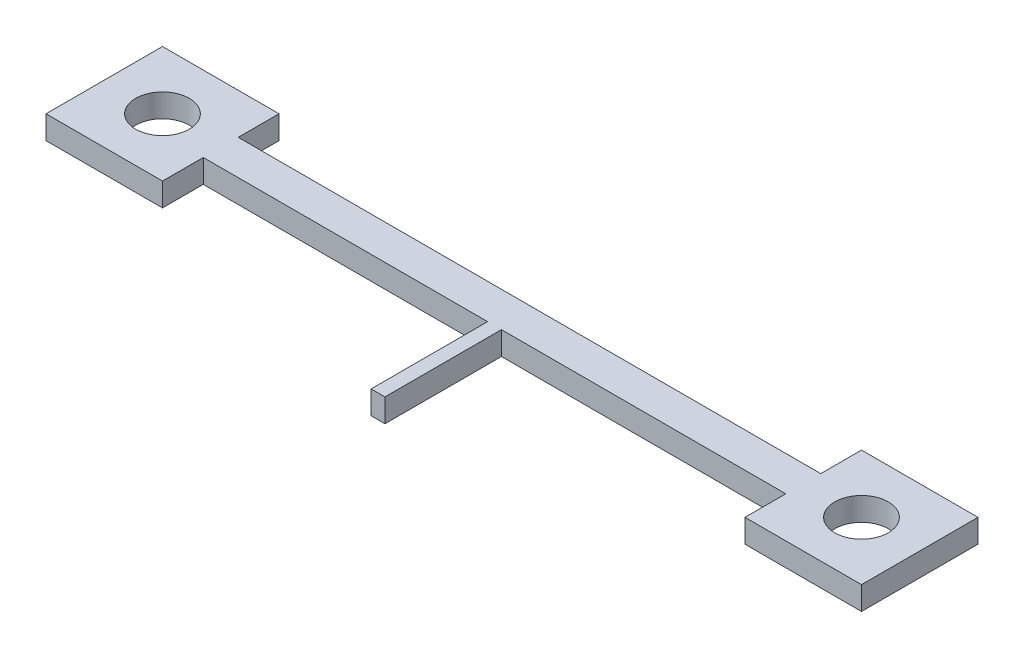
ISO-10303-21;
HEADER;
FILE_DESCRIPTION(('STEP AP214'),'2;1');
FILE_NAME('part.step','',(''),(''),'','','');
FILE_SCHEMA(('AUTOMOTIVE_DESIGN { 1 0 10303 214 1 1 1 1 }'));
ENDSEC;
DATA;
#1=APPLICATION_CONTEXT('core data for automotive mechanical design processes');
#2=APPLICATION_PROTOCOL_DEFINITION('international standard','automotive_design',2000,#1);
#3=PRODUCT_CONTEXT('',#1,'mechanical');
#4=PRODUCT('Part','Part','',(#3));
#5=PRODUCT_RELATED_PRODUCT_CATEGORY('part','',(#4));
#6=PRODUCT_DEFINITION_FORMATION('','',#4);
#7=PRODUCT_DEFINITION_CONTEXT('part definition',#1,'design');
#8=PRODUCT_DEFINITION('design','',#6,#7);
#9=PRODUCT_DEFINITION_SHAPE('','',#8);
#10=(LENGTH_UNIT() NAMED_UNIT(*) SI_UNIT(.MILLI.,.METRE.));
#11=(NAMED_UNIT(*) PLANE_ANGLE_UNIT() SI_UNIT($,.RADIAN.));
#12=(NAMED_UNIT(*) SI_UNIT($,.STERADIAN.) SOLID_ANGLE_UNIT());
#13=UNCERTAINTY_MEASURE_WITH_UNIT(LENGTH_MEASURE(1.E-05),#10,'distance_accuracy_value','');
#14=(GEOMETRIC_REPRESENTATION_CONTEXT(3) GLOBAL_UNCERTAINTY_ASSIGNED_CONTEXT((#13)) GLOBAL_UNIT_ASSIGNED_CONTEXT((#10,
#11,#12)) REPRESENTATION_CONTEXT('',''));
#15=CARTESIAN_POINT('',(0.,0.,0.));
#16=DIRECTION('',(0.,0.,1.));
#17=DIRECTION('',(1.,0.,0.));
#18=AXIS2_PLACEMENT_3D('',#15,#16,#17);
#19=CARTESIAN_POINT('',(-41.4240464845624,0.635,10.2832594653076));
#20=DIRECTION('',(0.,0.,-1.));
#21=DIRECTION('',(-1.,0.,0.));
#22=AXIS2_PLACEMENT_3D('',#19,#20,#21);
#23=PLANE('',#22);
#24=DIRECTION('',(0.,1.,0.));
#25=VECTOR('',#24,1.);
#26=CARTESIAN_POINT('',(-25.1720464765624,0.635,10.2832594653076));
#27=LINE('',#26,#25);
#28=CARTESIAN_POINT('',(-25.1720464765624,-0.634999999999999,10.2832594653076));
#29=VERTEX_POINT('',#28);
#30=CARTESIAN_POINT('',(-25.1720464765624,0.635,10.2832594653076));
#31=VERTEX_POINT('',#30);
#32=EDGE_CURVE('E499',#29,#31,#27,.T.);
#33=ORIENTED_EDGE('',*,*,#32,.F.);
#34=DIRECTION('',(1.,0.,0.));
#35=VECTOR('',#34,1.);
#36=CARTESIAN_POINT('',(-41.4240464845624,-0.635,10.2832594653076));
#37=LINE('',#36,#35);
#38=CARTESIAN_POINT('',(-9.67404648456241,-0.635,10.2832594653076));
#39=VERTEX_POINT('',#38);
#40=EDGE_CURVE('E181',#29,#39,#37,.T.);
#41=ORIENTED_EDGE('',*,*,#40,.T.);
#42=DIRECTION('',(0.,-1.,0.));
#43=VECTOR('',#42,1.);
#44=CARTESIAN_POINT('',(-9.67404648456241,0.635,10.2832594653076));
#45=LINE('',#44,#43);
#46=CARTESIAN_POINT('',(-9.67404648456241,0.635,10.2832594653076));
#47=VERTEX_POINT('',#46);
#48=EDGE_CURVE('E154',#47,#39,#45,.T.);
#49=ORIENTED_EDGE('',*,*,#48,.F.);
#50=DIRECTION('',(1.,0.,0.));
#51=VECTOR('',#50,1.);
#52=CARTESIAN_POINT('',(-41.4240464845624,0.635,10.2832594653076));
#53=LINE('',#52,#51);
#54=EDGE_CURVE('E144',#31,#47,#53,.T.);
#55=ORIENTED_EDGE('',*,*,#54,.F.);
#56=EDGE_LOOP('',(#33,#41,#49,#55));
#57=FACE_BOUND('',#56,.T.);
#58=ADVANCED_FACE('F36',(#57),#23,.F.);
#59=CARTESIAN_POINT('',(-41.4240464845624,-0.635,10.2832594653076));
#60=VERTEX_POINT('',#59);
#61=CARTESIAN_POINT('',(-25.9260464925624,-0.635,10.2832594653076));
#62=VERTEX_POINT('',#61);
#63=EDGE_CURVE('E182',#60,#62,#37,.T.);
#64=ORIENTED_EDGE('',*,*,#63,.T.);
#65=DIRECTION('',(0.,-1.,0.));
#66=VECTOR('',#65,1.);
#67=CARTESIAN_POINT('',(-25.9260464925624,0.635,10.2832594653076));
#68=LINE('',#67,#66);
#69=CARTESIAN_POINT('',(-25.9260464925624,0.635,10.2832594653076));
#70=VERTEX_POINT('',#69);
#71=EDGE_CURVE('E258',#70,#62,#68,.T.);
#72=ORIENTED_EDGE('',*,*,#71,.F.);
#73=CARTESIAN_POINT('',(-41.4240464845624,0.635,10.2832594653076));
#74=VERTEX_POINT('',#73);
#75=EDGE_CURVE('E148',#74,#70,#53,.T.);
#76=ORIENTED_EDGE('',*,*,#75,.F.);
#77=DIRECTION('',(0.,-1.,0.));
#78=VECTOR('',#77,1.);
#79=CARTESIAN_POINT('',(-41.4240464845624,0.635,10.2832594653076));
#80=LINE('',#79,#78);
#81=EDGE_CURVE('E192',#74,#60,#80,.T.);
#82=ORIENTED_EDGE('',*,*,#81,.T.);
#83=EDGE_LOOP('',(#64,#72,#76,#82));
#84=FACE_BOUND('',#83,.T.);
#85=ADVANCED_FACE('F255',(#84),#23,.F.);
#86=CARTESIAN_POINT('',(-9.67404648456241,0.635,6.15575946530759));
#87=DIRECTION('',(0.,0.,1.));
#88=DIRECTION('',(1.,0.,0.));
#89=AXIS2_PLACEMENT_3D('',#86,#87,#88);
#90=PLANE('',#89);
#91=DIRECTION('',(-1.,0.,0.));
#92=VECTOR('',#91,1.);
#93=CARTESIAN_POINT('',(-9.67404648456241,-0.635,6.15575946530759));
#94=LINE('',#93,#92);
#95=CARTESIAN_POINT('',(-3.32404648456241,-0.635,6.15575946530759));
#96=VERTEX_POINT('',#95);
#97=CARTESIAN_POINT('',(-9.67404648456241,-0.635,6.15575946530759));
#98=VERTEX_POINT('',#97);
#99=EDGE_CURVE('E163',#96,#98,#94,.T.);
#100=ORIENTED_EDGE('',*,*,#99,.T.);
#101=DIRECTION('',(0.,-1.,0.));
#102=VECTOR('',#101,1.);
#103=CARTESIAN_POINT('',(-9.67404648456241,0.635,6.15575946530759));
#104=LINE('',#103,#102);
#105=CARTESIAN_POINT('',(-9.67404648456241,0.635,6.15575946530759));
#106=VERTEX_POINT('',#105);
#107=EDGE_CURVE('E11',#106,#98,#104,.T.);
#108=ORIENTED_EDGE('',*,*,#107,.F.);
#109=DIRECTION('',(-1.,0.,0.));
#110=VECTOR('',#109,1.);
#111=CARTESIAN_POINT('',(-9.67404648456241,0.635,6.15575946530759));
#112=LINE('',#111,#110);
#113=CARTESIAN_POINT('',(-3.32404648456241,0.635,6.15575946530759));
#114=VERTEX_POINT('',#113);
#115=EDGE_CURVE('E188',#114,#106,#112,.T.);
#116=ORIENTED_EDGE('',*,*,#115,.F.);
#117=DIRECTION('',(0.,-1.,0.));
#118=VECTOR('',#117,1.);
#119=CARTESIAN_POINT('',(-3.32404648456241,0.635,6.15575946530759));
#120=LINE('',#119,#118);
#121=EDGE_CURVE('E159',#114,#96,#120,.T.);
#122=ORIENTED_EDGE('',*,*,#121,.T.);
#123=EDGE_LOOP('',(#100,#108,#116,#122));
#124=FACE_BOUND('',#123,.T.);
#125=ADVANCED_FACE('F38',(#124),#90,.F.);
#126=CARTESIAN_POINT('',(-9.67404648456241,0.635,8.37825946530759));
#127=DIRECTION('',(1.,0.,0.));
#128=DIRECTION('',(0.,0.,-1.));
#129=AXIS2_PLACEMENT_3D('',#126,#127,#128);
#130=PLANE('',#129);
#131=DIRECTION('',(0.,0.,1.));
#132=VECTOR('',#131,1.);
#133=CARTESIAN_POINT('',(-9.67404648456241,-0.635,8.37825946530759));
#134=LINE('',#133,#132);
#135=CARTESIAN_POINT('',(-9.67404648456241,-0.635,8.37825946530759));
#136=VERTEX_POINT('',#135);
#137=EDGE_CURVE('E166',#98,#136,#134,.T.);
#138=ORIENTED_EDGE('',*,*,#137,.T.);
#139=DIRECTION('',(0.,-1.,0.));
#140=VECTOR('',#139,1.);
#141=CARTESIAN_POINT('',(-9.67404648456241,0.635,8.37825946530759));
#142=LINE('',#141,#140);
#143=CARTESIAN_POINT('',(-9.67404648456241,0.635,8.37825946530759));
#144=VERTEX_POINT('',#143);
#145=EDGE_CURVE('E45',#144,#136,#142,.T.);
#146=ORIENTED_EDGE('',*,*,#145,.F.);
#147=DIRECTION('',(0.,0.,1.));
#148=VECTOR('',#147,1.);
#149=CARTESIAN_POINT('',(-9.67404648456241,0.635,8.37825946530759));
#150=LINE('',#149,#148);
#151=EDGE_CURVE('E109',#106,#144,#150,.T.);
#152=ORIENTED_EDGE('',*,*,#151,.F.);
#153=ORIENTED_EDGE('',*,*,#107,.T.);
#154=EDGE_LOOP('',(#138,#146,#152,#153));
#155=FACE_BOUND('',#154,.T.);
#156=ADVANCED_FACE('F296',(#155),#130,.F.);
#157=CARTESIAN_POINT('',(-41.4240464845624,0.635,8.37825946530759));
#158=DIRECTION('',(0.,0.,1.));
#159=DIRECTION('',(1.,0.,0.));
#160=AXIS2_PLACEMENT_3D('',#157,#158,#159);
#161=PLANE('',#160);
#162=DIRECTION('',(-1.,0.,0.));
#163=VECTOR('',#162,1.);
#164=CARTESIAN_POINT('',(-41.4240464845624,-0.635,8.37825946530759));
#165=LINE('',#164,#163);
#166=CARTESIAN_POINT('',(-41.4240464845624,-0.635,8.37825946530759));
#167=VERTEX_POINT('',#166);
#168=EDGE_CURVE('E169',#136,#167,#165,.T.);
#169=ORIENTED_EDGE('',*,*,#168,.T.);
#170=DIRECTION('',(0.,-1.,0.));
#171=VECTOR('',#170,1.);
#172=CARTESIAN_POINT('',(-41.4240464845624,0.635,8.37825946530759));
#173=LINE('',#172,#171);
#174=CARTESIAN_POINT('',(-41.4240464845624,0.635,8.37825946530759));
#175=VERTEX_POINT('',#174);
#176=EDGE_CURVE('E207',#175,#167,#173,.T.);
#177=ORIENTED_EDGE('',*,*,#176,.F.);
#178=DIRECTION('',(-1.,0.,0.));
#179=VECTOR('',#178,1.);
#180=CARTESIAN_POINT('',(-41.4240464845624,0.635,8.37825946530759));
#181=LINE('',#180,#179);
#182=EDGE_CURVE('E215',#144,#175,#181,.T.);
#183=ORIENTED_EDGE('',*,*,#182,.F.);
#184=ORIENTED_EDGE('',*,*,#145,.T.);
#185=EDGE_LOOP('',(#169,#177,#183,#184));
#186=FACE_BOUND('',#185,.T.);
#187=ADVANCED_FACE('F213',(#186),#161,.F.);
#188=CARTESIAN_POINT('',(-41.4240464845624,0.635,8.37825946530759));
#189=DIRECTION('',(-1.,0.,0.));
#190=DIRECTION('',(0.,0.,1.));
#191=AXIS2_PLACEMENT_3D('',#188,#189,#190);
#192=PLANE('',#191);
#193=DIRECTION('',(0.,0.,-1.));
#194=VECTOR('',#193,1.);
#195=CARTESIAN_POINT('',(-41.4240464845624,-0.635,8.37825946530759));
#196=LINE('',#195,#194);
#197=CARTESIAN_POINT('',(-41.4240464845624,-0.635,6.15575946530758));
#198=VERTEX_POINT('',#197);
#199=EDGE_CURVE('E171',#167,#198,#196,.T.);
#200=ORIENTED_EDGE('',*,*,#199,.T.);
#201=DIRECTION('',(0.,-1.,0.));
#202=VECTOR('',#201,1.);
#203=CARTESIAN_POINT('',(-41.4240464845624,0.635,6.15575946530758));
#204=LINE('',#203,#202);
#205=CARTESIAN_POINT('',(-41.4240464845624,0.635,6.15575946530758));
#206=VERTEX_POINT('',#205);
#207=EDGE_CURVE('E204',#206,#198,#204,.T.);
#208=ORIENTED_EDGE('',*,*,#207,.F.);
#209=DIRECTION('',(0.,0.,-1.));
#210=VECTOR('',#209,1.);
#211=CARTESIAN_POINT('',(-41.4240464845624,0.635,8.37825946530759));
#212=LINE('',#211,#210);
#213=EDGE_CURVE('E235',#175,#206,#212,.T.);
#214=ORIENTED_EDGE('',*,*,#213,.F.);
#215=ORIENTED_EDGE('',*,*,#176,.T.);
#216=EDGE_LOOP('',(#200,#208,#214,#215));
#217=FACE_BOUND('',#216,.T.);
#218=ADVANCED_FACE('F226',(#217),#192,.F.);
#219=CARTESIAN_POINT('',(-47.7740464845624,0.635,6.15575946530758));
#220=DIRECTION('',(0.,0.,1.));
#221=DIRECTION('',(1.,0.,0.));
#222=AXIS2_PLACEMENT_3D('',#219,#220,#221);
#223=PLANE('',#222);
#224=DIRECTION('',(-1.,0.,0.));
#225=VECTOR('',#224,1.);
#226=CARTESIAN_POINT('',(-47.7740464845624,-0.635,6.15575946530758));
#227=LINE('',#226,#225);
#228=CARTESIAN_POINT('',(-47.7740464845624,-0.635,6.15575946530758));
#229=VERTEX_POINT('',#228);
#230=EDGE_CURVE('E173',#198,#229,#227,.T.);
#231=ORIENTED_EDGE('',*,*,#230,.T.);
#232=DIRECTION('',(0.,-1.,0.));
#233=VECTOR('',#232,1.);
#234=CARTESIAN_POINT('',(-47.7740464845624,0.635,6.15575946530758));
#235=LINE('',#234,#233);
#236=CARTESIAN_POINT('',(-47.7740464845624,0.635,6.15575946530758));
#237=VERTEX_POINT('',#236);
#238=EDGE_CURVE('E201',#237,#229,#235,.T.);
#239=ORIENTED_EDGE('',*,*,#238,.F.);
#240=DIRECTION('',(-1.,0.,0.));
#241=VECTOR('',#240,1.);
#242=CARTESIAN_POINT('',(-47.7740464845624,0.635,6.15575946530758));
#243=LINE('',#242,#241);
#244=EDGE_CURVE('E232',#206,#237,#243,.T.);
#245=ORIENTED_EDGE('',*,*,#244,.F.);
#246=ORIENTED_EDGE('',*,*,#207,.T.);
#247=EDGE_LOOP('',(#231,#239,#245,#246));
#248=FACE_BOUND('',#247,.T.);
#249=ADVANCED_FACE('F230',(#248),#223,.F.);
#250=CARTESIAN_POINT('',(-47.7740464845624,0.635,12.5057594653076));
#251=DIRECTION('',(1.,0.,0.));
#252=DIRECTION('',(0.,0.,-1.));
#253=AXIS2_PLACEMENT_3D('',#250,#251,#252);
#254=PLANE('',#253);
#255=DIRECTION('',(0.,0.,1.));
#256=VECTOR('',#255,1.);
#257=CARTESIAN_POINT('',(-47.7740464845624,-0.635,12.5057594653076));
#258=LINE('',#257,#256);
#259=CARTESIAN_POINT('',(-47.7740464845624,-0.635,12.5057594653076));
#260=VERTEX_POINT('',#259);
#261=EDGE_CURVE('E175',#229,#260,#258,.T.);
#262=ORIENTED_EDGE('',*,*,#261,.T.);
#263=DIRECTION('',(0.,-1.,0.));
#264=VECTOR('',#263,1.);
#265=CARTESIAN_POINT('',(-47.7740464845624,0.635,12.5057594653076));
#266=LINE('',#265,#264);
#267=CARTESIAN_POINT('',(-47.7740464845624,0.635,12.5057594653076));
#268=VERTEX_POINT('',#267);
#269=EDGE_CURVE('E198',#268,#260,#266,.T.);
#270=ORIENTED_EDGE('',*,*,#269,.F.);
#271=DIRECTION('',(0.,0.,1.));
#272=VECTOR('',#271,1.);
#273=CARTESIAN_POINT('',(-47.7740464845624,0.635,12.5057594653076));
#274=LINE('',#273,#272);
#275=EDGE_CURVE('E234',#237,#268,#274,.T.);
#276=ORIENTED_EDGE('',*,*,#275,.F.);
#277=ORIENTED_EDGE('',*,*,#238,.T.);
#278=EDGE_LOOP('',(#262,#270,#276,#277));
#279=FACE_BOUND('',#278,.T.);
#280=ADVANCED_FACE('F320',(#279),#254,.F.);
#281=CARTESIAN_POINT('',(-47.7740464845624,0.635,12.5057594653076));
#282=DIRECTION('',(0.,0.,-1.));
#283=DIRECTION('',(-1.,0.,0.));
#284=AXIS2_PLACEMENT_3D('',#281,#282,#283);
#285=PLANE('',#284);
#286=DIRECTION('',(1.,0.,0.));
#287=VECTOR('',#286,1.);
#288=CARTESIAN_POINT('',(-47.7740464845624,-0.635,12.5057594653076));
#289=LINE('',#288,#287);
#290=CARTESIAN_POINT('',(-41.4240464845624,-0.635,12.5057594653076));
#291=VERTEX_POINT('',#290);
#292=EDGE_CURVE('E177',#260,#291,#289,.T.);
#293=ORIENTED_EDGE('',*,*,#292,.T.);
#294=DIRECTION('',(0.,-1.,0.));
#295=VECTOR('',#294,1.);
#296=CARTESIAN_POINT('',(-41.4240464845624,0.635,12.5057594653076));
#297=LINE('',#296,#295);
#298=CARTESIAN_POINT('',(-41.4240464845624,0.635,12.5057594653076));
#299=VERTEX_POINT('',#298);
#300=EDGE_CURVE('E195',#299,#291,#297,.T.);
#301=ORIENTED_EDGE('',*,*,#300,.F.);
#302=DIRECTION('',(1.,0.,0.));
#303=VECTOR('',#302,1.);
#304=CARTESIAN_POINT('',(-47.7740464845624,0.635,12.5057594653076));
#305=LINE('',#304,#303);
#306=EDGE_CURVE('E237',#268,#299,#305,.T.);
#307=ORIENTED_EDGE('',*,*,#306,.F.);
#308=ORIENTED_EDGE('',*,*,#269,.T.);
#309=EDGE_LOOP('',(#293,#301,#307,#308));
#310=FACE_BOUND('',#309,.T.);
#311=ADVANCED_FACE('F316',(#310),#285,.F.);
#312=CARTESIAN_POINT('',(-41.4240464845624,0.635,10.2832594653076));
#313=DIRECTION('',(-1.,0.,0.));
#314=DIRECTION('',(0.,0.,1.));
#315=AXIS2_PLACEMENT_3D('',#312,#313,#314);
#316=PLANE('',#315);
#317=DIRECTION('',(0.,0.,-1.));
#318=VECTOR('',#317,1.);
#319=CARTESIAN_POINT('',(-41.4240464845624,-0.635,10.2832594653076));
#320=LINE('',#319,#318);
#321=EDGE_CURVE('E179',#291,#60,#320,.T.);
#322=ORIENTED_EDGE('',*,*,#321,.T.);
#323=ORIENTED_EDGE('',*,*,#81,.F.);
#324=DIRECTION('',(0.,0.,-1.));
#325=VECTOR('',#324,1.);
#326=CARTESIAN_POINT('',(-41.4240464845624,0.635,10.2832594653076));
#327=LINE('',#326,#325);
#328=EDGE_CURVE('E243',#299,#74,#327,.T.);
#329=ORIENTED_EDGE('',*,*,#328,.F.);
#330=ORIENTED_EDGE('',*,*,#300,.T.);
#331=EDGE_LOOP('',(#322,#323,#329,#330));
#332=FACE_BOUND('',#331,.T.);
#333=ADVANCED_FACE('F313',(#332),#316,.F.);
#334=CARTESIAN_POINT('',(-9.67404648456241,0.635,10.2832594653076));
#335=DIRECTION('',(1.,0.,0.));
#336=DIRECTION('',(0.,0.,-1.));
#337=AXIS2_PLACEMENT_3D('',#334,#335,#336);
#338=PLANE('',#337);
#339=DIRECTION('',(0.,0.,1.));
#340=VECTOR('',#339,1.);
#341=CARTESIAN_POINT('',(-9.67404648456241,-0.635,10.2832594653076));
#342=LINE('',#341,#340);
#343=CARTESIAN_POINT('',(-9.67404648456241,-0.635,12.5057594653076));
#344=VERTEX_POINT('',#343);
#345=EDGE_CURVE('E153',#39,#344,#342,.T.);
#346=ORIENTED_EDGE('',*,*,#345,.T.);
#347=DIRECTION('',(0.,-1.,0.));
#348=VECTOR('',#347,1.);
#349=CARTESIAN_POINT('',(-9.67404648456241,0.635,12.5057594653076));
#350=LINE('',#349,#348);
#351=CARTESIAN_POINT('',(-9.67404648456241,0.635,12.5057594653076));
#352=VERTEX_POINT('',#351);
#353=EDGE_CURVE('E150',#352,#344,#350,.T.);
#354=ORIENTED_EDGE('',*,*,#353,.F.);
#355=DIRECTION('',(0.,0.,1.));
#356=VECTOR('',#355,1.);
#357=CARTESIAN_POINT('',(-9.67404648456241,0.635,10.2832594653076));
#358=LINE('',#357,#356);
#359=EDGE_CURVE('E136',#47,#352,#358,.T.);
#360=ORIENTED_EDGE('',*,*,#359,.F.);
#361=ORIENTED_EDGE('',*,*,#48,.T.);
#362=EDGE_LOOP('',(#346,#354,#360,#361));
#363=FACE_BOUND('',#362,.T.);
#364=ADVANCED_FACE('F151',(#363),#338,.F.);
#365=CARTESIAN_POINT('',(-9.67404648456241,0.635,12.5057594653076));
#366=DIRECTION('',(0.,0.,-1.));
#367=DIRECTION('',(-1.,0.,0.));
#368=AXIS2_PLACEMENT_3D('',#365,#366,#367);
#369=PLANE('',#368);
#370=DIRECTION('',(1.,0.,0.));
#371=VECTOR('',#370,1.);
#372=CARTESIAN_POINT('',(-9.67404648456241,-0.635,12.5057594653076));
#373=LINE('',#372,#371);
#374=CARTESIAN_POINT('',(-3.32404648456241,-0.635,12.5057594653076));
#375=VERTEX_POINT('',#374);
#376=EDGE_CURVE('E95',#344,#375,#373,.T.);
#377=ORIENTED_EDGE('',*,*,#376,.T.);
#378=DIRECTION('',(0.,-1.,0.));
#379=VECTOR('',#378,1.);
#380=CARTESIAN_POINT('',(-3.32404648456241,0.635,12.5057594653076));
#381=LINE('',#380,#379);
#382=CARTESIAN_POINT('',(-3.32404648456241,0.635,12.5057594653076));
#383=VERTEX_POINT('',#382);
#384=EDGE_CURVE('E155',#383,#375,#381,.T.);
#385=ORIENTED_EDGE('',*,*,#384,.F.);
#386=DIRECTION('',(1.,0.,0.));
#387=VECTOR('',#386,1.);
#388=CARTESIAN_POINT('',(-9.67404648456241,0.635,12.5057594653076));
#389=LINE('',#388,#387);
#390=EDGE_CURVE('E142',#352,#383,#389,.T.);
#391=ORIENTED_EDGE('',*,*,#390,.F.);
#392=ORIENTED_EDGE('',*,*,#353,.T.);
#393=EDGE_LOOP('',(#377,#385,#391,#392));
#394=FACE_BOUND('',#393,.T.);
#395=ADVANCED_FACE('F157',(#394),#369,.F.);
#396=CARTESIAN_POINT('',(-3.32404648456241,0.635,12.5057594653076));
#397=DIRECTION('',(-1.,0.,0.));
#398=DIRECTION('',(0.,0.,1.));
#399=AXIS2_PLACEMENT_3D('',#396,#397,#398);
#400=PLANE('',#399);
#401=DIRECTION('',(0.,0.,-1.));
#402=VECTOR('',#401,1.);
#403=CARTESIAN_POINT('',(-3.32404648456241,-0.635,12.5057594653076));
#404=LINE('',#403,#402);
#405=EDGE_CURVE('E101',#375,#96,#404,.T.);
#406=ORIENTED_EDGE('',*,*,#405,.T.);
#407=ORIENTED_EDGE('',*,*,#121,.F.);
#408=DIRECTION('',(0.,0.,-1.));
#409=VECTOR('',#408,1.);
#410=CARTESIAN_POINT('',(-3.32404648456241,0.635,12.5057594653076));
#411=LINE('',#410,#409);
#412=EDGE_CURVE('E53',#383,#114,#411,.T.);
#413=ORIENTED_EDGE('',*,*,#412,.F.);
#414=ORIENTED_EDGE('',*,*,#384,.T.);
#415=EDGE_LOOP('',(#406,#407,#413,#414));
#416=FACE_BOUND('',#415,.T.);
#417=ADVANCED_FACE('F359',(#416),#400,.F.);
#418=CARTESIAN_POINT('',(-3.32404648456241,0.635,6.15575946530759));
#419=DIRECTION('',(0.,1.,0.));
#420=DIRECTION('',(0.,0.,1.));
#421=AXIS2_PLACEMENT_3D('',#418,#419,#420);
#422=PLANE('',#421);
#423=DIRECTION('',(0.,0.,1.));
#424=VECTOR('',#423,1.);
#425=CARTESIAN_POINT('',(-25.1720464765624,0.635,10.2832594653076));
#426=LINE('',#425,#424);
#427=CARTESIAN_POINT('',(-25.1720464765624,0.634999999999999,16.6332594653076));
#428=VERTEX_POINT('',#427);
#429=EDGE_CURVE('E502',#31,#428,#426,.T.);
#430=ORIENTED_EDGE('',*,*,#429,.F.);
#431=ORIENTED_EDGE('',*,*,#54,.T.);
#432=ORIENTED_EDGE('',*,*,#359,.T.);
#433=ORIENTED_EDGE('',*,*,#390,.T.);
#434=ORIENTED_EDGE('',*,*,#412,.T.);
#435=ORIENTED_EDGE('',*,*,#115,.T.);
#436=ORIENTED_EDGE('',*,*,#151,.T.);
#437=ORIENTED_EDGE('',*,*,#182,.T.);
#438=ORIENTED_EDGE('',*,*,#213,.T.);
#439=ORIENTED_EDGE('',*,*,#244,.T.);
#440=ORIENTED_EDGE('',*,*,#275,.T.);
#441=ORIENTED_EDGE('',*,*,#306,.T.);
#442=ORIENTED_EDGE('',*,*,#328,.T.);
#443=ORIENTED_EDGE('',*,*,#75,.T.);
#444=DIRECTION('',(0.,0.,-1.));
#445=VECTOR('',#444,1.);
#446=CARTESIAN_POINT('',(-25.9260464925624,0.635,10.2832594653076));
#447=LINE('',#446,#445);
#448=CARTESIAN_POINT('',(-25.9260464925624,0.635,16.6332594653076));
#449=VERTEX_POINT('',#448);
#450=EDGE_CURVE('E250',#449,#70,#447,.T.);
#451=ORIENTED_EDGE('',*,*,#450,.F.);
#452=DIRECTION('',(-1.,0.,0.));
#453=VECTOR('',#452,1.);
#454=CARTESIAN_POINT('',(-25.7990464925624,0.635,16.6332594653076));
#455=LINE('',#454,#453);
#456=EDGE_CURVE('E278',#428,#449,#455,.T.);
#457=ORIENTED_EDGE('',*,*,#456,.F.);
#458=EDGE_LOOP('',(#430,#431,#432,#433,#434,#435,#436,#437,#438,#439,#440,#441,#442,#443,#451,#457));
#459=FACE_BOUND('',#458,.T.);
#460=CARTESIAN_POINT('',(-6.49904648456241,0.635,9.33075946530758));
#461=DIRECTION('',(0.,1.,0.));
#462=DIRECTION('',(0.,0.,1.));
#463=AXIS2_PLACEMENT_3D('',#460,#461,#462);
#464=CIRCLE('',#463,1.4605);
#465=CARTESIAN_POINT('',(-6.49904648456241,0.635,10.7912594653076));
#466=VERTEX_POINT('',#465);
#467=EDGE_CURVE('E281',#466,#466,#464,.T.);
#468=ORIENTED_EDGE('',*,*,#467,.F.);
#469=EDGE_LOOP('',(#468));
#470=FACE_BOUND('',#469,.T.);
#471=CARTESIAN_POINT('',(-44.5990464845624,0.635,9.33075946530758));
#472=DIRECTION('',(0.,1.,0.));
#473=DIRECTION('',(0.,0.,1.));
#474=AXIS2_PLACEMENT_3D('',#471,#472,#473);
#475=CIRCLE('',#474,1.4605);
#476=CARTESIAN_POINT('',(-44.5990464845624,0.635,10.7912594653076));
#477=VERTEX_POINT('',#476);
#478=EDGE_CURVE('E287',#477,#477,#475,.T.);
#479=ORIENTED_EDGE('',*,*,#478,.F.);
#480=EDGE_LOOP('',(#479));
#481=FACE_BOUND('',#480,.T.);
#482=ADVANCED_FACE('F139',(#459,#470,#481),#422,.T.);
#483=CARTESIAN_POINT('',(-3.32404648456241,-0.635,6.15575946530759));
#484=DIRECTION('',(0.,1.,0.));
#485=DIRECTION('',(0.,0.,1.));
#486=AXIS2_PLACEMENT_3D('',#483,#484,#485);
#487=PLANE('',#486);
#488=ORIENTED_EDGE('',*,*,#40,.F.);
#489=DIRECTION('',(0.,0.,-1.));
#490=VECTOR('',#489,1.);
#491=CARTESIAN_POINT('',(-25.1720464765624,-0.634999999999999,10.2832594653076));
#492=LINE('',#491,#490);
#493=CARTESIAN_POINT('',(-25.1720464765624,-0.635,16.6332594653076));
#494=VERTEX_POINT('',#493);
#495=EDGE_CURVE('E263',#494,#29,#492,.T.);
#496=ORIENTED_EDGE('',*,*,#495,.F.);
#497=DIRECTION('',(1.,0.,0.));
#498=VECTOR('',#497,1.);
#499=CARTESIAN_POINT('',(-25.2990464765624,-0.635,16.6332594653076));
#500=LINE('',#499,#498);
#501=CARTESIAN_POINT('',(-25.9260464925624,-0.635,16.6332594653076));
#502=VERTEX_POINT('',#501);
#503=EDGE_CURVE('E275',#502,#494,#500,.T.);
#504=ORIENTED_EDGE('',*,*,#503,.F.);
#505=DIRECTION('',(0.,0.,1.));
#506=VECTOR('',#505,1.);
#507=CARTESIAN_POINT('',(-25.9260464925624,-0.635,10.2832594653076));
#508=LINE('',#507,#506);
#509=EDGE_CURVE('E262',#62,#502,#508,.T.);
#510=ORIENTED_EDGE('',*,*,#509,.F.);
#511=ORIENTED_EDGE('',*,*,#63,.F.);
#512=ORIENTED_EDGE('',*,*,#321,.F.);
#513=ORIENTED_EDGE('',*,*,#292,.F.);
#514=ORIENTED_EDGE('',*,*,#261,.F.);
#515=ORIENTED_EDGE('',*,*,#230,.F.);
#516=ORIENTED_EDGE('',*,*,#199,.F.);
#517=ORIENTED_EDGE('',*,*,#168,.F.);
#518=ORIENTED_EDGE('',*,*,#137,.F.);
#519=ORIENTED_EDGE('',*,*,#99,.F.);
#520=ORIENTED_EDGE('',*,*,#405,.F.);
#521=ORIENTED_EDGE('',*,*,#376,.F.);
#522=ORIENTED_EDGE('',*,*,#345,.F.);
#523=EDGE_LOOP('',(#488,#496,#504,#510,#511,#512,#513,#514,#515,#516,#517,#518,#519,#520,#521,#522));
#524=FACE_BOUND('',#523,.T.);
#525=CARTESIAN_POINT('',(-6.49904648456241,-0.635,9.33075946530758));
#526=DIRECTION('',(0.,1.,0.));
#527=DIRECTION('',(0.,0.,1.));
#528=AXIS2_PLACEMENT_3D('',#525,#526,#527);
#529=CIRCLE('',#528,1.4605);
#530=CARTESIAN_POINT('',(-6.49904648456241,-0.635,10.7912594653076));
#531=VERTEX_POINT('',#530);
#532=EDGE_CURVE('E284',#531,#531,#529,.T.);
#533=ORIENTED_EDGE('',*,*,#532,.T.);
#534=EDGE_LOOP('',(#533));
#535=FACE_BOUND('',#534,.T.);
#536=CARTESIAN_POINT('',(-44.5990464845624,-0.635,9.33075946530758));
#537=DIRECTION('',(0.,1.,0.));
#538=DIRECTION('',(0.,0.,1.));
#539=AXIS2_PLACEMENT_3D('',#536,#537,#538);
#540=CIRCLE('',#539,1.4605);
#541=CARTESIAN_POINT('',(-44.5990464845624,-0.635,10.7912594653076));
#542=VERTEX_POINT('',#541);
#543=EDGE_CURVE('E167',#542,#542,#540,.T.);
#544=ORIENTED_EDGE('',*,*,#543,.T.);
#545=EDGE_LOOP('',(#544));
#546=FACE_BOUND('',#545,.T.);
#547=ADVANCED_FACE('F219',(#524,#535,#546),#487,.F.);
#548=CARTESIAN_POINT('',(-44.5990464845624,0.635,9.33075946530758));
#549=DIRECTION('',(0.,1.,0.));
#550=DIRECTION('',(0.,0.,1.));
#551=AXIS2_PLACEMENT_3D('',#548,#549,#550);
#552=CYLINDRICAL_SURFACE('',#551,1.4605);
#553=ORIENTED_EDGE('',*,*,#543,.F.);
#554=EDGE_LOOP('',(#553));
#555=FACE_BOUND('',#554,.T.);
#556=ORIENTED_EDGE('',*,*,#478,.T.);
#557=EDGE_LOOP('',(#556));
#558=FACE_BOUND('',#557,.T.);
#559=ADVANCED_FACE('F378',(#555,#558),#552,.F.);
#560=CARTESIAN_POINT('',(-6.49904648456241,0.635,9.33075946530758));
#561=DIRECTION('',(0.,1.,0.));
#562=DIRECTION('',(0.,0.,1.));
#563=AXIS2_PLACEMENT_3D('',#560,#561,#562);
#564=CYLINDRICAL_SURFACE('',#563,1.4605);
#565=ORIENTED_EDGE('',*,*,#532,.F.);
#566=EDGE_LOOP('',(#565));
#567=FACE_BOUND('',#566,.T.);
#568=ORIENTED_EDGE('',*,*,#467,.T.);
#569=EDGE_LOOP('',(#568));
#570=FACE_BOUND('',#569,.T.);
#571=ADVANCED_FACE('F385',(#567,#570),#564,.F.);
#572=CARTESIAN_POINT('',(0.,0.,16.6332594653076));
#573=DIRECTION('',(0.,0.,-1.));
#574=DIRECTION('',(-1.,0.,0.));
#575=AXIS2_PLACEMENT_3D('',#572,#573,#574);
#576=PLANE('',#575);
#577=ORIENTED_EDGE('',*,*,#456,.T.);
#578=DIRECTION('',(0.,1.,0.));
#579=VECTOR('',#578,1.);
#580=CARTESIAN_POINT('',(-25.9260464925624,0.635,16.6332594653076));
#581=LINE('',#580,#579);
#582=EDGE_CURVE('E265',#502,#449,#581,.T.);
#583=ORIENTED_EDGE('',*,*,#582,.F.);
#584=ORIENTED_EDGE('',*,*,#503,.T.);
#585=DIRECTION('',(0.,-1.,0.));
#586=VECTOR('',#585,1.);
#587=CARTESIAN_POINT('',(-25.1720464765624,0.634999999999999,16.6332594653076));
#588=LINE('',#587,#586);
#589=EDGE_CURVE('E268',#428,#494,#588,.T.);
#590=ORIENTED_EDGE('',*,*,#589,.F.);
#591=EDGE_LOOP('',(#577,#583,#584,#590));
#592=FACE_BOUND('',#591,.T.);
#593=ADVANCED_FACE('F393',(#592),#576,.F.);
#594=CARTESIAN_POINT('',(-25.9260464925624,0.,0.));
#595=DIRECTION('',(-1.,0.,0.));
#596=DIRECTION('',(0.,0.,1.));
#597=AXIS2_PLACEMENT_3D('',#594,#595,#596);
#598=PLANE('',#597);
#599=ORIENTED_EDGE('',*,*,#71,.T.);
#600=ORIENTED_EDGE('',*,*,#509,.T.);
#601=ORIENTED_EDGE('',*,*,#582,.T.);
#602=ORIENTED_EDGE('',*,*,#450,.T.);
#603=EDGE_LOOP('',(#599,#600,#601,#602));
#604=FACE_BOUND('',#603,.T.);
#605=ADVANCED_FACE('F401',(#604),#598,.T.);
#606=CARTESIAN_POINT('',(-25.1720464765624,0.,0.));
#607=DIRECTION('',(-1.,0.,0.));
#608=DIRECTION('',(0.,0.,1.));
#609=AXIS2_PLACEMENT_3D('',#606,#607,#608);
#610=PLANE('',#609);
#611=ORIENTED_EDGE('',*,*,#32,.T.);
#612=ORIENTED_EDGE('',*,*,#429,.T.);
#613=ORIENTED_EDGE('',*,*,#589,.T.);
#614=ORIENTED_EDGE('',*,*,#495,.T.);
#615=EDGE_LOOP('',(#611,#612,#613,#614));
#616=FACE_BOUND('',#615,.T.);
#617=ADVANCED_FACE('F410',(#616),#610,.F.);
#618=CLOSED_SHELL('',(#58,#85,#125,#156,#187,#218,#249,#280,#311,#333,#364,#395,#417,#482,#547,
#559,#571,#593,#605,#617));
#619=MANIFOLD_SOLID_BREP('B2',#618);
#620=ADVANCED_BREP_SHAPE_REPRESENTATION('',(#18,#619),#14);
#621=SHAPE_DEFINITION_REPRESENTATION(#9,#620);
ENDSEC;
END-ISO-10303-21;
